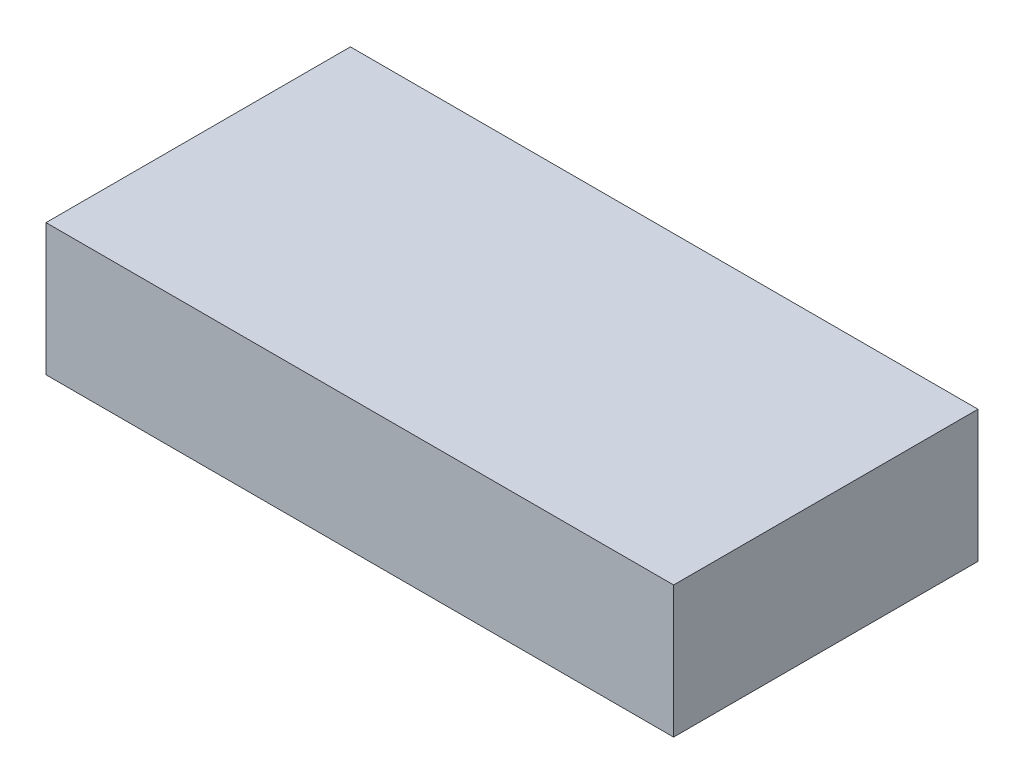
ISO-10303-21;
HEADER;
FILE_DESCRIPTION(('STEP AP214'),'2;1');
FILE_NAME('part.step','',(''),(''),'','','');
FILE_SCHEMA(('AUTOMOTIVE_DESIGN { 1 0 10303 214 1 1 1 1 }'));
ENDSEC;
DATA;
#1=APPLICATION_CONTEXT('core data for automotive mechanical design processes');
#2=APPLICATION_PROTOCOL_DEFINITION('international standard','automotive_design',2000,#1);
#3=PRODUCT_CONTEXT('',#1,'mechanical');
#4=PRODUCT('Part','Part','',(#3));
#5=PRODUCT_RELATED_PRODUCT_CATEGORY('part','',(#4));
#6=PRODUCT_DEFINITION_FORMATION('','',#4);
#7=PRODUCT_DEFINITION_CONTEXT('part definition',#1,'design');
#8=PRODUCT_DEFINITION('design','',#6,#7);
#9=PRODUCT_DEFINITION_SHAPE('','',#8);
#10=(LENGTH_UNIT() NAMED_UNIT(*) SI_UNIT(.MILLI.,.METRE.));
#11=(NAMED_UNIT(*) PLANE_ANGLE_UNIT() SI_UNIT($,.RADIAN.));
#12=(NAMED_UNIT(*) SI_UNIT($,.STERADIAN.) SOLID_ANGLE_UNIT());
#13=UNCERTAINTY_MEASURE_WITH_UNIT(LENGTH_MEASURE(1.E-05),#10,'distance_accuracy_value','');
#14=(GEOMETRIC_REPRESENTATION_CONTEXT(3) GLOBAL_UNCERTAINTY_ASSIGNED_CONTEXT((#13)) GLOBAL_UNIT_ASSIGNED_CONTEXT((#10,
#11,#12)) REPRESENTATION_CONTEXT('',''));
#15=CARTESIAN_POINT('',(0.,0.,0.));
#16=DIRECTION('',(0.,0.,1.));
#17=DIRECTION('',(1.,0.,0.));
#18=AXIS2_PLACEMENT_3D('',#15,#16,#17);
#19=CARTESIAN_POINT('',(100.,42.,-48.5));
#20=DIRECTION('',(-1.,0.,0.));
#21=DIRECTION('',(0.,0.,1.));
#22=AXIS2_PLACEMENT_3D('',#19,#20,#21);
#23=PLANE('',#22);
#24=DIRECTION('',(0.,0.,-1.));
#25=VECTOR('',#24,1.);
#26=CARTESIAN_POINT('',(100.,0.,-48.5));
#27=LINE('',#26,#25);
#28=CARTESIAN_POINT('',(100.,0.,48.5));
#29=VERTEX_POINT('',#28);
#30=CARTESIAN_POINT('',(100.,0.,-48.5));
#31=VERTEX_POINT('',#30);
#32=EDGE_CURVE('E107',#29,#31,#27,.T.);
#33=ORIENTED_EDGE('',*,*,#32,.T.);
#34=DIRECTION('',(0.,-1.,0.));
#35=VECTOR('',#34,1.);
#36=CARTESIAN_POINT('',(100.,42.,-48.5));
#37=LINE('',#36,#35);
#38=CARTESIAN_POINT('',(100.,42.,-48.5));
#39=VERTEX_POINT('',#38);
#40=EDGE_CURVE('E11',#39,#31,#37,.T.);
#41=ORIENTED_EDGE('',*,*,#40,.F.);
#42=DIRECTION('',(0.,0.,-1.));
#43=VECTOR('',#42,1.);
#44=CARTESIAN_POINT('',(100.,42.,-48.5));
#45=LINE('',#44,#43);
#46=CARTESIAN_POINT('',(100.,42.,48.5));
#47=VERTEX_POINT('',#46);
#48=EDGE_CURVE('E91',#47,#39,#45,.T.);
#49=ORIENTED_EDGE('',*,*,#48,.F.);
#50=DIRECTION('',(0.,-1.,0.));
#51=VECTOR('',#50,1.);
#52=CARTESIAN_POINT('',(100.,42.,48.5));
#53=LINE('',#52,#51);
#54=EDGE_CURVE('E103',#47,#29,#53,.T.);
#55=ORIENTED_EDGE('',*,*,#54,.T.);
#56=EDGE_LOOP('',(#33,#41,#49,#55));
#57=FACE_BOUND('',#56,.T.);
#58=ADVANCED_FACE('F39',(#57),#23,.F.);
#59=CARTESIAN_POINT('',(-100.,42.,-48.5));
#60=DIRECTION('',(0.,0.,1.));
#61=DIRECTION('',(1.,0.,0.));
#62=AXIS2_PLACEMENT_3D('',#59,#60,#61);
#63=PLANE('',#62);
#64=DIRECTION('',(-1.,0.,0.));
#65=VECTOR('',#64,1.);
#66=CARTESIAN_POINT('',(-100.,0.,-48.5));
#67=LINE('',#66,#65);
#68=CARTESIAN_POINT('',(-100.,0.,-48.5));
#69=VERTEX_POINT('',#68);
#70=EDGE_CURVE('E96',#31,#69,#67,.T.);
#71=ORIENTED_EDGE('',*,*,#70,.T.);
#72=DIRECTION('',(0.,-1.,0.));
#73=VECTOR('',#72,1.);
#74=CARTESIAN_POINT('',(-100.,42.,-48.5));
#75=LINE('',#74,#73);
#76=CARTESIAN_POINT('',(-100.,42.,-48.5));
#77=VERTEX_POINT('',#76);
#78=EDGE_CURVE('E48',#77,#69,#75,.T.);
#79=ORIENTED_EDGE('',*,*,#78,.F.);
#80=DIRECTION('',(-1.,0.,0.));
#81=VECTOR('',#80,1.);
#82=CARTESIAN_POINT('',(-100.,42.,-48.5));
#83=LINE('',#82,#81);
#84=EDGE_CURVE('E86',#39,#77,#83,.T.);
#85=ORIENTED_EDGE('',*,*,#84,.F.);
#86=ORIENTED_EDGE('',*,*,#40,.T.);
#87=EDGE_LOOP('',(#71,#79,#85,#86));
#88=FACE_BOUND('',#87,.T.);
#89=ADVANCED_FACE('F95',(#88),#63,.F.);
#90=CARTESIAN_POINT('',(-100.,42.,-48.5));
#91=DIRECTION('',(1.,0.,0.));
#92=DIRECTION('',(0.,0.,-1.));
#93=AXIS2_PLACEMENT_3D('',#90,#91,#92);
#94=PLANE('',#93);
#95=DIRECTION('',(0.,0.,1.));
#96=VECTOR('',#95,1.);
#97=CARTESIAN_POINT('',(-100.,0.,-48.5));
#98=LINE('',#97,#96);
#99=CARTESIAN_POINT('',(-100.,0.,48.5));
#100=VERTEX_POINT('',#99);
#101=EDGE_CURVE('E73',#69,#100,#98,.T.);
#102=ORIENTED_EDGE('',*,*,#101,.T.);
#103=DIRECTION('',(0.,-1.,0.));
#104=VECTOR('',#103,1.);
#105=CARTESIAN_POINT('',(-100.,42.,48.5));
#106=LINE('',#105,#104);
#107=CARTESIAN_POINT('',(-100.,42.,48.5));
#108=VERTEX_POINT('',#107);
#109=EDGE_CURVE('E98',#108,#100,#106,.T.);
#110=ORIENTED_EDGE('',*,*,#109,.F.);
#111=DIRECTION('',(0.,0.,1.));
#112=VECTOR('',#111,1.);
#113=CARTESIAN_POINT('',(-100.,42.,-48.5));
#114=LINE('',#113,#112);
#115=EDGE_CURVE('E89',#77,#108,#114,.T.);
#116=ORIENTED_EDGE('',*,*,#115,.F.);
#117=ORIENTED_EDGE('',*,*,#78,.T.);
#118=EDGE_LOOP('',(#102,#110,#116,#117));
#119=FACE_BOUND('',#118,.T.);
#120=ADVANCED_FACE('F99',(#119),#94,.F.);
#121=CARTESIAN_POINT('',(-100.,42.,48.5));
#122=DIRECTION('',(0.,0.,-1.));
#123=DIRECTION('',(-1.,0.,0.));
#124=AXIS2_PLACEMENT_3D('',#121,#122,#123);
#125=PLANE('',#124);
#126=DIRECTION('',(1.,0.,0.));
#127=VECTOR('',#126,1.);
#128=CARTESIAN_POINT('',(-100.,0.,48.5));
#129=LINE('',#128,#127);
#130=EDGE_CURVE('E79',#100,#29,#129,.T.);
#131=ORIENTED_EDGE('',*,*,#130,.T.);
#132=ORIENTED_EDGE('',*,*,#54,.F.);
#133=DIRECTION('',(1.,0.,0.));
#134=VECTOR('',#133,1.);
#135=CARTESIAN_POINT('',(-100.,42.,48.5));
#136=LINE('',#135,#134);
#137=EDGE_CURVE('E56',#108,#47,#136,.T.);
#138=ORIENTED_EDGE('',*,*,#137,.F.);
#139=ORIENTED_EDGE('',*,*,#109,.T.);
#140=EDGE_LOOP('',(#131,#132,#138,#139));
#141=FACE_BOUND('',#140,.T.);
#142=ADVANCED_FACE('F120',(#141),#125,.F.);
#143=CARTESIAN_POINT('',(0.,42.,0.));
#144=DIRECTION('',(0.,1.,0.));
#145=DIRECTION('',(0.,0.,1.));
#146=AXIS2_PLACEMENT_3D('',#143,#144,#145);
#147=PLANE('',#146);
#148=ORIENTED_EDGE('',*,*,#48,.T.);
#149=ORIENTED_EDGE('',*,*,#84,.T.);
#150=ORIENTED_EDGE('',*,*,#115,.T.);
#151=ORIENTED_EDGE('',*,*,#137,.T.);
#152=EDGE_LOOP('',(#148,#149,#150,#151));
#153=FACE_BOUND('',#152,.T.);
#154=ADVANCED_FACE('F87',(#153),#147,.T.);
#155=CARTESIAN_POINT('',(0.,0.,0.));
#156=DIRECTION('',(0.,1.,0.));
#157=DIRECTION('',(0.,0.,1.));
#158=AXIS2_PLACEMENT_3D('',#155,#156,#157);
#159=PLANE('',#158);
#160=ORIENTED_EDGE('',*,*,#32,.F.);
#161=ORIENTED_EDGE('',*,*,#130,.F.);
#162=ORIENTED_EDGE('',*,*,#101,.F.);
#163=ORIENTED_EDGE('',*,*,#70,.F.);
#164=EDGE_LOOP('',(#160,#161,#162,#163));
#165=FACE_BOUND('',#164,.T.);
#166=ADVANCED_FACE('F123',(#165),#159,.F.);
#167=CLOSED_SHELL('',(#58,#89,#120,#142,#154,#166));
#168=MANIFOLD_SOLID_BREP('B2',#167);
#169=ADVANCED_BREP_SHAPE_REPRESENTATION('',(#18,#168),#14);
#170=SHAPE_DEFINITION_REPRESENTATION(#9,#169);
ENDSEC;
END-ISO-10303-21;
